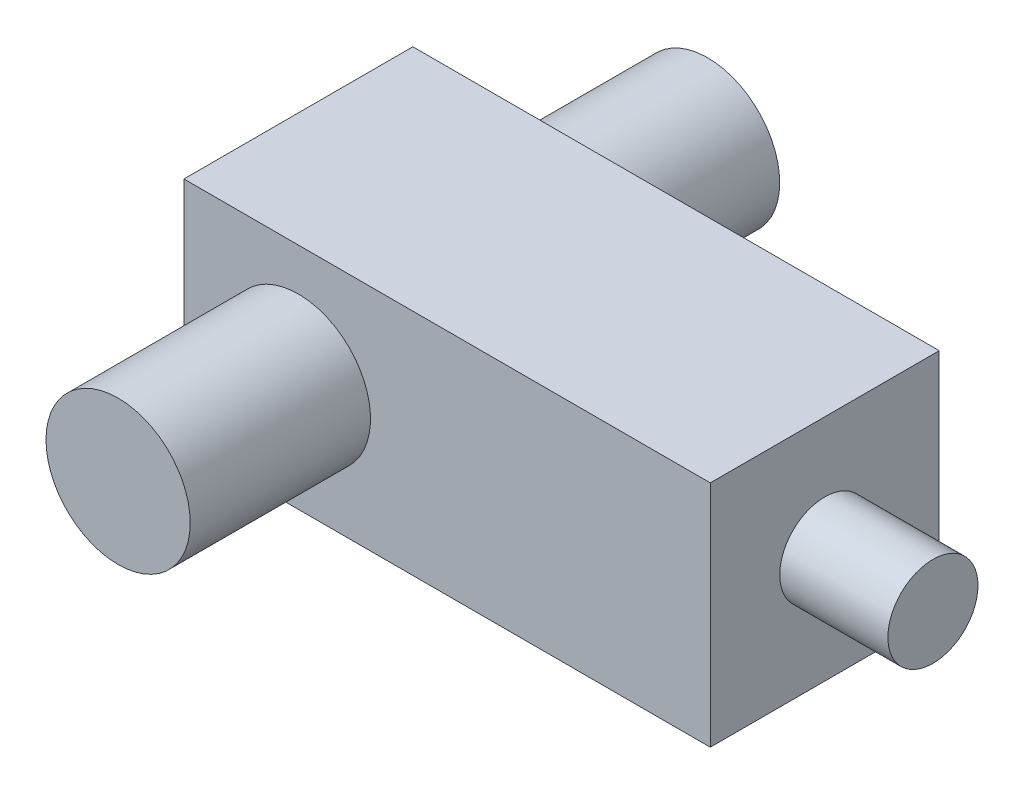
ISO-10303-21;
HEADER;
FILE_DESCRIPTION(('STEP AP214'),'2;1');
FILE_NAME('part.step','',(''),(''),'','','');
FILE_SCHEMA(('AUTOMOTIVE_DESIGN { 1 0 10303 214 1 1 1 1 }'));
ENDSEC;
DATA;
#1=APPLICATION_CONTEXT('core data for automotive mechanical design processes');
#2=APPLICATION_PROTOCOL_DEFINITION('international standard','automotive_design',2000,#1);
#3=PRODUCT_CONTEXT('',#1,'mechanical');
#4=PRODUCT('Part','Part','',(#3));
#5=PRODUCT_RELATED_PRODUCT_CATEGORY('part','',(#4));
#6=PRODUCT_DEFINITION_FORMATION('','',#4);
#7=PRODUCT_DEFINITION_CONTEXT('part definition',#1,'design');
#8=PRODUCT_DEFINITION('design','',#6,#7);
#9=PRODUCT_DEFINITION_SHAPE('','',#8);
#10=(LENGTH_UNIT() NAMED_UNIT(*) SI_UNIT(.MILLI.,.METRE.));
#11=(NAMED_UNIT(*) PLANE_ANGLE_UNIT() SI_UNIT($,.RADIAN.));
#12=(NAMED_UNIT(*) SI_UNIT($,.STERADIAN.) SOLID_ANGLE_UNIT());
#13=UNCERTAINTY_MEASURE_WITH_UNIT(LENGTH_MEASURE(1.E-05),#10,'distance_accuracy_value','');
#14=(GEOMETRIC_REPRESENTATION_CONTEXT(3) GLOBAL_UNCERTAINTY_ASSIGNED_CONTEXT((#13)) GLOBAL_UNIT_ASSIGNED_CONTEXT((#10,
#11,#12)) REPRESENTATION_CONTEXT('',''));
#15=CARTESIAN_POINT('',(0.,0.,0.));
#16=DIRECTION('',(0.,0.,1.));
#17=DIRECTION('',(1.,0.,0.));
#18=AXIS2_PLACEMENT_3D('',#15,#16,#17);
#19=CARTESIAN_POINT('',(14.6,12.7,6.35));
#20=DIRECTION('',(-1.,0.,0.));
#21=DIRECTION('',(0.,0.,1.));
#22=AXIS2_PLACEMENT_3D('',#19,#20,#21);
#23=PLANE('',#22);
#24=CARTESIAN_POINT('',(14.6,6.35,0.));
#25=DIRECTION('',(1.,0.,0.));
#26=DIRECTION('',(0.,0.,-1.));
#27=AXIS2_PLACEMENT_3D('',#24,#25,#26);
#28=CIRCLE('',#27,2.5);
#29=CARTESIAN_POINT('',(14.6,6.35,-2.5));
#30=VERTEX_POINT('',#29);
#31=EDGE_CURVE('E11',#30,#30,#28,.T.);
#32=ORIENTED_EDGE('',*,*,#31,.F.);
#33=EDGE_LOOP('',(#32));
#34=FACE_BOUND('',#33,.T.);
#35=DIRECTION('',(0.,0.,-1.));
#36=VECTOR('',#35,1.);
#37=CARTESIAN_POINT('',(14.6,0.,6.35));
#38=LINE('',#37,#36);
#39=CARTESIAN_POINT('',(14.6,0.,6.35));
#40=VERTEX_POINT('',#39);
#41=CARTESIAN_POINT('',(14.6,0.,-6.35));
#42=VERTEX_POINT('',#41);
#43=EDGE_CURVE('E116',#40,#42,#38,.T.);
#44=ORIENTED_EDGE('',*,*,#43,.T.);
#45=DIRECTION('',(0.,-1.,0.));
#46=VECTOR('',#45,1.);
#47=CARTESIAN_POINT('',(14.6,12.7,-6.35));
#48=LINE('',#47,#46);
#49=CARTESIAN_POINT('',(14.6,12.7,-6.35));
#50=VERTEX_POINT('',#49);
#51=EDGE_CURVE('E105',#50,#42,#48,.T.);
#52=ORIENTED_EDGE('',*,*,#51,.F.);
#53=DIRECTION('',(0.,0.,-1.));
#54=VECTOR('',#53,1.);
#55=CARTESIAN_POINT('',(14.6,12.7,6.35));
#56=LINE('',#55,#54);
#57=CARTESIAN_POINT('',(14.6,12.7,6.35));
#58=VERTEX_POINT('',#57);
#59=EDGE_CURVE('E97',#58,#50,#56,.T.);
#60=ORIENTED_EDGE('',*,*,#59,.F.);
#61=DIRECTION('',(0.,-1.,0.));
#62=VECTOR('',#61,1.);
#63=CARTESIAN_POINT('',(14.6,12.7,6.35));
#64=LINE('',#63,#62);
#65=EDGE_CURVE('E112',#58,#40,#64,.T.);
#66=ORIENTED_EDGE('',*,*,#65,.T.);
#67=EDGE_LOOP('',(#44,#52,#60,#66));
#68=FACE_BOUND('',#67,.T.);
#69=ADVANCED_FACE('F43',(#34,#68),#23,.F.);
#70=CARTESIAN_POINT('',(-14.6,12.7,-6.35));
#71=DIRECTION('',(0.,0.,1.));
#72=DIRECTION('',(1.,0.,0.));
#73=AXIS2_PLACEMENT_3D('',#70,#71,#72);
#74=PLANE('',#73);
#75=CARTESIAN_POINT('',(-8.25,6.35,-6.35));
#76=DIRECTION('',(0.,0.,1.));
#77=DIRECTION('',(1.,0.,0.));
#78=AXIS2_PLACEMENT_3D('',#75,#76,#77);
#79=CIRCLE('',#78,4.);
#80=CARTESIAN_POINT('',(-4.25,6.35,-6.35));
#81=VERTEX_POINT('',#80);
#82=EDGE_CURVE('E193',#81,#81,#79,.T.);
#83=ORIENTED_EDGE('',*,*,#82,.T.);
#84=EDGE_LOOP('',(#83));
#85=FACE_BOUND('',#84,.T.);
#86=DIRECTION('',(-1.,0.,0.));
#87=VECTOR('',#86,1.);
#88=CARTESIAN_POINT('',(-14.6,0.,-6.35));
#89=LINE('',#88,#87);
#90=CARTESIAN_POINT('',(-14.6,0.,-6.35));
#91=VERTEX_POINT('',#90);
#92=EDGE_CURVE('E103',#42,#91,#89,.T.);
#93=ORIENTED_EDGE('',*,*,#92,.T.);
#94=DIRECTION('',(0.,-1.,0.));
#95=VECTOR('',#94,1.);
#96=CARTESIAN_POINT('',(-14.6,12.7,-6.35));
#97=LINE('',#96,#95);
#98=CARTESIAN_POINT('',(-14.6,12.7,-6.35));
#99=VERTEX_POINT('',#98);
#100=EDGE_CURVE('E101',#99,#91,#97,.T.);
#101=ORIENTED_EDGE('',*,*,#100,.F.);
#102=DIRECTION('',(-1.,0.,0.));
#103=VECTOR('',#102,1.);
#104=CARTESIAN_POINT('',(-14.6,12.7,-6.35));
#105=LINE('',#104,#103);
#106=EDGE_CURVE('E92',#50,#99,#105,.T.);
#107=ORIENTED_EDGE('',*,*,#106,.F.);
#108=ORIENTED_EDGE('',*,*,#51,.T.);
#109=EDGE_LOOP('',(#93,#101,#107,#108));
#110=FACE_BOUND('',#109,.T.);
#111=ADVANCED_FACE('F102',(#85,#110),#74,.F.);
#112=CARTESIAN_POINT('',(-14.6,12.7,6.35));
#113=DIRECTION('',(1.,0.,0.));
#114=DIRECTION('',(0.,0.,-1.));
#115=AXIS2_PLACEMENT_3D('',#112,#113,#114);
#116=PLANE('',#115);
#117=DIRECTION('',(0.,0.,1.));
#118=VECTOR('',#117,1.);
#119=CARTESIAN_POINT('',(-14.6,0.,6.35));
#120=LINE('',#119,#118);
#121=CARTESIAN_POINT('',(-14.6,0.,6.35));
#122=VERTEX_POINT('',#121);
#123=EDGE_CURVE('E78',#91,#122,#120,.T.);
#124=ORIENTED_EDGE('',*,*,#123,.T.);
#125=DIRECTION('',(0.,-1.,0.));
#126=VECTOR('',#125,1.);
#127=CARTESIAN_POINT('',(-14.6,12.7,6.35));
#128=LINE('',#127,#126);
#129=CARTESIAN_POINT('',(-14.6,12.7,6.35));
#130=VERTEX_POINT('',#129);
#131=EDGE_CURVE('E106',#130,#122,#128,.T.);
#132=ORIENTED_EDGE('',*,*,#131,.F.);
#133=DIRECTION('',(0.,0.,1.));
#134=VECTOR('',#133,1.);
#135=CARTESIAN_POINT('',(-14.6,12.7,6.35));
#136=LINE('',#135,#134);
#137=EDGE_CURVE('E95',#99,#130,#136,.T.);
#138=ORIENTED_EDGE('',*,*,#137,.F.);
#139=ORIENTED_EDGE('',*,*,#100,.T.);
#140=EDGE_LOOP('',(#124,#132,#138,#139));
#141=FACE_BOUND('',#140,.T.);
#142=ADVANCED_FACE('F108',(#141),#116,.F.);
#143=CARTESIAN_POINT('',(-14.6,12.7,6.35));
#144=DIRECTION('',(0.,0.,-1.));
#145=DIRECTION('',(-1.,0.,0.));
#146=AXIS2_PLACEMENT_3D('',#143,#144,#145);
#147=PLANE('',#146);
#148=CARTESIAN_POINT('',(-8.25,6.35,6.35));
#149=DIRECTION('',(0.,0.,-1.));
#150=DIRECTION('',(-1.,0.,0.));
#151=AXIS2_PLACEMENT_3D('',#148,#149,#150);
#152=CIRCLE('',#151,4.);
#153=CARTESIAN_POINT('',(-12.25,6.35,6.35));
#154=VERTEX_POINT('',#153);
#155=EDGE_CURVE('E46',#154,#154,#152,.F.);
#156=ORIENTED_EDGE('',*,*,#155,.F.);
#157=EDGE_LOOP('',(#156));
#158=FACE_BOUND('',#157,.T.);
#159=DIRECTION('',(1.,0.,0.));
#160=VECTOR('',#159,1.);
#161=CARTESIAN_POINT('',(-14.6,0.,6.35));
#162=LINE('',#161,#160);
#163=EDGE_CURVE('E84',#122,#40,#162,.T.);
#164=ORIENTED_EDGE('',*,*,#163,.T.);
#165=ORIENTED_EDGE('',*,*,#65,.F.);
#166=DIRECTION('',(1.,0.,0.));
#167=VECTOR('',#166,1.);
#168=CARTESIAN_POINT('',(-14.6,12.7,6.35));
#169=LINE('',#168,#167);
#170=EDGE_CURVE('E61',#130,#58,#169,.T.);
#171=ORIENTED_EDGE('',*,*,#170,.F.);
#172=ORIENTED_EDGE('',*,*,#131,.T.);
#173=EDGE_LOOP('',(#164,#165,#171,#172));
#174=FACE_BOUND('',#173,.T.);
#175=ADVANCED_FACE('F137',(#158,#174),#147,.F.);
#176=CARTESIAN_POINT('',(0.,12.7,0.));
#177=DIRECTION('',(0.,-1.,0.));
#178=DIRECTION('',(0.,0.,-1.));
#179=AXIS2_PLACEMENT_3D('',#176,#177,#178);
#180=PLANE('',#179);
#181=ORIENTED_EDGE('',*,*,#59,.T.);
#182=ORIENTED_EDGE('',*,*,#106,.T.);
#183=ORIENTED_EDGE('',*,*,#137,.T.);
#184=ORIENTED_EDGE('',*,*,#170,.T.);
#185=EDGE_LOOP('',(#181,#182,#183,#184));
#186=FACE_BOUND('',#185,.T.);
#187=ADVANCED_FACE('F93',(#186),#180,.F.);
#188=CARTESIAN_POINT('',(0.,0.,0.));
#189=DIRECTION('',(0.,-1.,0.));
#190=DIRECTION('',(0.,0.,-1.));
#191=AXIS2_PLACEMENT_3D('',#188,#189,#190);
#192=PLANE('',#191);
#193=ORIENTED_EDGE('',*,*,#43,.F.);
#194=ORIENTED_EDGE('',*,*,#163,.F.);
#195=ORIENTED_EDGE('',*,*,#123,.F.);
#196=ORIENTED_EDGE('',*,*,#92,.F.);
#197=EDGE_LOOP('',(#193,#194,#195,#196));
#198=FACE_BOUND('',#197,.T.);
#199=ADVANCED_FACE('F145',(#198),#192,.T.);
#200=CARTESIAN_POINT('',(-8.25,6.35,16.35));
#201=DIRECTION('',(0.,0.,-1.));
#202=DIRECTION('',(-1.,0.,0.));
#203=AXIS2_PLACEMENT_3D('',#200,#201,#202);
#204=CYLINDRICAL_SURFACE('',#203,4.);
#205=CARTESIAN_POINT('',(-8.25,6.35,16.35));
#206=DIRECTION('',(0.,0.,1.));
#207=DIRECTION('',(1.,0.,0.));
#208=AXIS2_PLACEMENT_3D('',#205,#206,#207);
#209=CIRCLE('',#208,4.);
#210=CARTESIAN_POINT('',(-4.25,6.35,16.35));
#211=VERTEX_POINT('',#210);
#212=EDGE_CURVE('E120',#211,#211,#209,.T.);
#213=ORIENTED_EDGE('',*,*,#212,.F.);
#214=EDGE_LOOP('',(#213));
#215=FACE_BOUND('',#214,.T.);
#216=ORIENTED_EDGE('',*,*,#155,.T.);
#217=EDGE_LOOP('',(#216));
#218=FACE_BOUND('',#217,.T.);
#219=ADVANCED_FACE('F135',(#215,#218),#204,.T.);
#220=CARTESIAN_POINT('',(-8.25,6.35,16.35));
#221=DIRECTION('',(0.,0.,1.));
#222=DIRECTION('',(1.,0.,0.));
#223=AXIS2_PLACEMENT_3D('',#220,#221,#222);
#224=PLANE('',#223);
#225=ORIENTED_EDGE('',*,*,#212,.T.);
#226=EDGE_LOOP('',(#225));
#227=FACE_BOUND('',#226,.T.);
#228=ADVANCED_FACE('F165',(#227),#224,.T.);
#229=CARTESIAN_POINT('',(-8.25,6.35,-16.35));
#230=DIRECTION('',(0.,0.,1.));
#231=DIRECTION('',(1.,0.,0.));
#232=AXIS2_PLACEMENT_3D('',#229,#230,#231);
#233=CYLINDRICAL_SURFACE('',#232,4.);
#234=CARTESIAN_POINT('',(-8.25,6.35,-16.35));
#235=DIRECTION('',(0.,0.,1.));
#236=DIRECTION('',(1.,0.,0.));
#237=AXIS2_PLACEMENT_3D('',#234,#235,#236);
#238=CIRCLE('',#237,4.);
#239=CARTESIAN_POINT('',(-4.25,6.35,-16.35));
#240=VERTEX_POINT('',#239);
#241=EDGE_CURVE('E197',#240,#240,#238,.T.);
#242=ORIENTED_EDGE('',*,*,#241,.T.);
#243=EDGE_LOOP('',(#242));
#244=FACE_BOUND('',#243,.T.);
#245=ORIENTED_EDGE('',*,*,#82,.F.);
#246=EDGE_LOOP('',(#245));
#247=FACE_BOUND('',#246,.T.);
#248=ADVANCED_FACE('F171',(#244,#247),#233,.T.);
#249=CARTESIAN_POINT('',(-8.25,6.35,-16.35));
#250=DIRECTION('',(0.,0.,-1.));
#251=DIRECTION('',(1.,0.,0.));
#252=AXIS2_PLACEMENT_3D('',#249,#250,#251);
#253=PLANE('',#252);
#254=ORIENTED_EDGE('',*,*,#241,.F.);
#255=EDGE_LOOP('',(#254));
#256=FACE_BOUND('',#255,.T.);
#257=ADVANCED_FACE('F175',(#256),#253,.T.);
#258=CARTESIAN_POINT('',(20.6,6.35,0.));
#259=DIRECTION('',(-1.,0.,0.));
#260=DIRECTION('',(0.,0.,1.));
#261=AXIS2_PLACEMENT_3D('',#258,#259,#260);
#262=CYLINDRICAL_SURFACE('',#261,2.5);
#263=CARTESIAN_POINT('',(20.6,6.35,0.));
#264=DIRECTION('',(1.,0.,0.));
#265=DIRECTION('',(0.,0.,-1.));
#266=AXIS2_PLACEMENT_3D('',#263,#264,#265);
#267=CIRCLE('',#266,2.5);
#268=CARTESIAN_POINT('',(20.6,6.35,-2.5));
#269=VERTEX_POINT('',#268);
#270=EDGE_CURVE('E191',#269,#269,#267,.T.);
#271=ORIENTED_EDGE('',*,*,#270,.F.);
#272=EDGE_LOOP('',(#271));
#273=FACE_BOUND('',#272,.T.);
#274=ORIENTED_EDGE('',*,*,#31,.T.);
#275=EDGE_LOOP('',(#274));
#276=FACE_BOUND('',#275,.T.);
#277=ADVANCED_FACE('F179',(#273,#276),#262,.T.);
#278=CARTESIAN_POINT('',(20.6,6.35,0.));
#279=DIRECTION('',(1.,0.,0.));
#280=DIRECTION('',(0.,0.,-1.));
#281=AXIS2_PLACEMENT_3D('',#278,#279,#280);
#282=PLANE('',#281);
#283=ORIENTED_EDGE('',*,*,#270,.T.);
#284=EDGE_LOOP('',(#283));
#285=FACE_BOUND('',#284,.T.);
#286=ADVANCED_FACE('F183',(#285),#282,.T.);
#287=CLOSED_SHELL('',(#69,#111,#142,#175,#187,#199,#219,#228,#248,#257,#277,#286));
#288=MANIFOLD_SOLID_BREP('B2',#287);
#289=ADVANCED_BREP_SHAPE_REPRESENTATION('',(#18,#288),#14);
#290=SHAPE_DEFINITION_REPRESENTATION(#9,#289);
ENDSEC;
END-ISO-10303-21;
